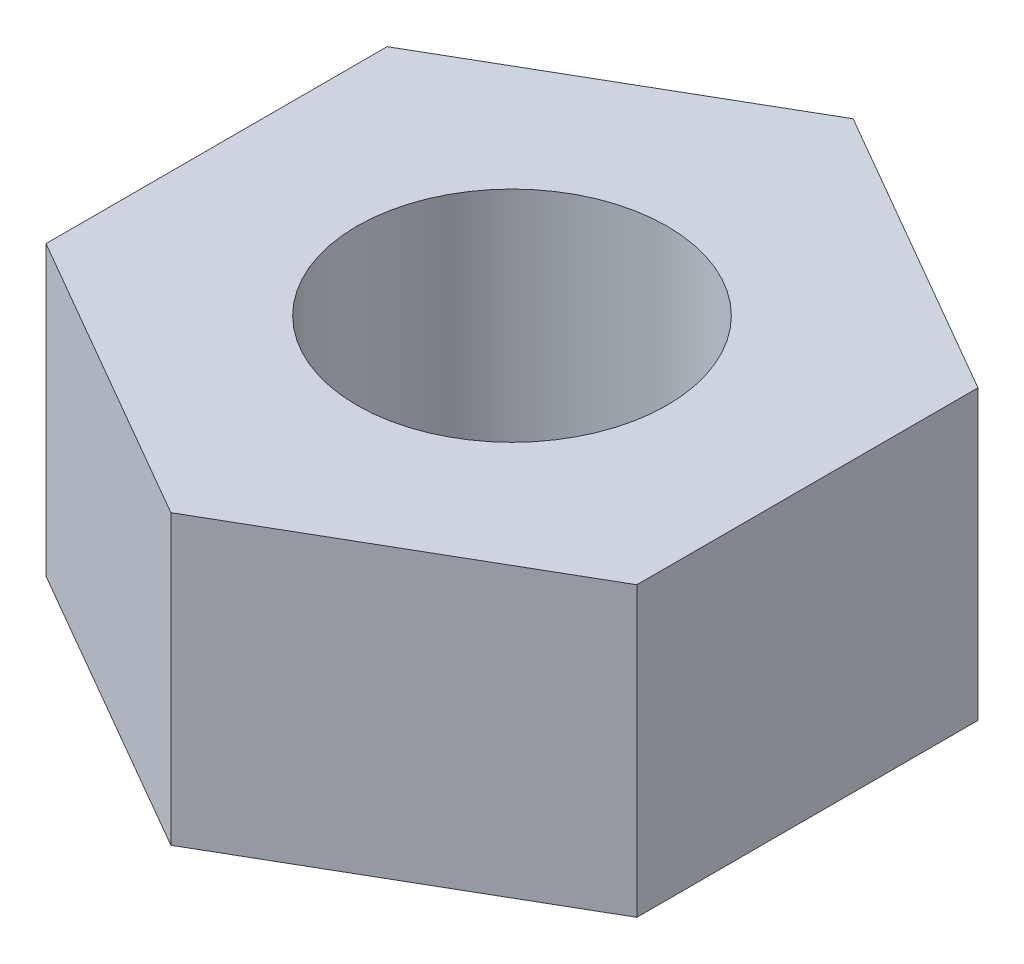
ISO-10303-21;
HEADER;
FILE_DESCRIPTION(('STEP AP214'),'2;1');
FILE_NAME('part.step','',(''),(''),'','','');
FILE_SCHEMA(('AUTOMOTIVE_DESIGN { 1 0 10303 214 1 1 1 1 }'));
ENDSEC;
DATA;
#1=APPLICATION_CONTEXT('core data for automotive mechanical design processes');
#2=APPLICATION_PROTOCOL_DEFINITION('international standard','automotive_design',2000,#1);
#3=PRODUCT_CONTEXT('',#1,'mechanical');
#4=PRODUCT('Part','Part','',(#3));
#5=PRODUCT_RELATED_PRODUCT_CATEGORY('part','',(#4));
#6=PRODUCT_DEFINITION_FORMATION('','',#4);
#7=PRODUCT_DEFINITION_CONTEXT('part definition',#1,'design');
#8=PRODUCT_DEFINITION('design','',#6,#7);
#9=PRODUCT_DEFINITION_SHAPE('','',#8);
#10=(LENGTH_UNIT() NAMED_UNIT(*) SI_UNIT(.MILLI.,.METRE.));
#11=(NAMED_UNIT(*) PLANE_ANGLE_UNIT() SI_UNIT($,.RADIAN.));
#12=(NAMED_UNIT(*) SI_UNIT($,.STERADIAN.) SOLID_ANGLE_UNIT());
#13=UNCERTAINTY_MEASURE_WITH_UNIT(LENGTH_MEASURE(1.E-05),#10,'distance_accuracy_value','');
#14=(GEOMETRIC_REPRESENTATION_CONTEXT(3) GLOBAL_UNCERTAINTY_ASSIGNED_CONTEXT((#13)) GLOBAL_UNIT_ASSIGNED_CONTEXT((#10,
#11,#12)) REPRESENTATION_CONTEXT('',''));
#15=CARTESIAN_POINT('',(0.,0.,0.));
#16=DIRECTION('',(0.,0.,1.));
#17=DIRECTION('',(1.,0.,0.));
#18=AXIS2_PLACEMENT_3D('',#15,#16,#17);
#19=CARTESIAN_POINT('',(0.,3.9,4.61880215351701));
#20=DIRECTION('',(-0.5,0.,-0.866025403784439));
#21=DIRECTION('',(-0.866025403784439,0.,0.5));
#22=AXIS2_PLACEMENT_3D('',#19,#20,#21);
#23=PLANE('',#22);
#24=DIRECTION('',(0.866025403784439,0.,-0.5));
#25=VECTOR('',#24,1.);
#26=CARTESIAN_POINT('',(0.,0.,4.61880215351701));
#27=LINE('',#26,#25);
#28=CARTESIAN_POINT('',(0.,0.,4.61880215351701));
#29=VERTEX_POINT('',#28);
#30=CARTESIAN_POINT('',(4.,0.,2.3094010767585));
#31=VERTEX_POINT('',#30);
#32=EDGE_CURVE('E121',#29,#31,#27,.T.);
#33=ORIENTED_EDGE('',*,*,#32,.T.);
#34=DIRECTION('',(0.,-1.,0.));
#35=VECTOR('',#34,1.);
#36=CARTESIAN_POINT('',(4.,3.9,2.3094010767585));
#37=LINE('',#36,#35);
#38=CARTESIAN_POINT('',(4.,3.9,2.3094010767585));
#39=VERTEX_POINT('',#38);
#40=EDGE_CURVE('E11',#39,#31,#37,.T.);
#41=ORIENTED_EDGE('',*,*,#40,.F.);
#42=DIRECTION('',(0.866025403784439,0.,-0.5));
#43=VECTOR('',#42,1.);
#44=CARTESIAN_POINT('',(0.,3.9,4.61880215351701));
#45=LINE('',#44,#43);
#46=CARTESIAN_POINT('',(0.,3.9,4.61880215351701));
#47=VERTEX_POINT('',#46);
#48=EDGE_CURVE('E132',#47,#39,#45,.T.);
#49=ORIENTED_EDGE('',*,*,#48,.F.);
#50=DIRECTION('',(0.,-1.,0.));
#51=VECTOR('',#50,1.);
#52=CARTESIAN_POINT('',(0.,3.9,4.61880215351701));
#53=LINE('',#52,#51);
#54=EDGE_CURVE('E117',#47,#29,#53,.T.);
#55=ORIENTED_EDGE('',*,*,#54,.T.);
#56=EDGE_LOOP('',(#33,#41,#49,#55));
#57=FACE_BOUND('',#56,.T.);
#58=ADVANCED_FACE('F37',(#57),#23,.F.);
#59=CARTESIAN_POINT('',(4.,3.9,2.3094010767585));
#60=DIRECTION('',(-1.,0.,0.));
#61=DIRECTION('',(0.,0.,1.));
#62=AXIS2_PLACEMENT_3D('',#59,#60,#61);
#63=PLANE('',#62);
#64=DIRECTION('',(0.,0.,-1.));
#65=VECTOR('',#64,1.);
#66=CARTESIAN_POINT('',(4.,0.,2.3094010767585));
#67=LINE('',#66,#65);
#68=CARTESIAN_POINT('',(4.,0.,-2.3094010767585));
#69=VERTEX_POINT('',#68);
#70=EDGE_CURVE('E124',#31,#69,#67,.T.);
#71=ORIENTED_EDGE('',*,*,#70,.T.);
#72=DIRECTION('',(0.,-1.,0.));
#73=VECTOR('',#72,1.);
#74=CARTESIAN_POINT('',(4.,3.9,-2.3094010767585));
#75=LINE('',#74,#73);
#76=CARTESIAN_POINT('',(4.,3.9,-2.3094010767585));
#77=VERTEX_POINT('',#76);
#78=EDGE_CURVE('E45',#77,#69,#75,.T.);
#79=ORIENTED_EDGE('',*,*,#78,.F.);
#80=DIRECTION('',(0.,0.,-1.));
#81=VECTOR('',#80,1.);
#82=CARTESIAN_POINT('',(4.,3.9,2.3094010767585));
#83=LINE('',#82,#81);
#84=EDGE_CURVE('E90',#39,#77,#83,.T.);
#85=ORIENTED_EDGE('',*,*,#84,.F.);
#86=ORIENTED_EDGE('',*,*,#40,.T.);
#87=EDGE_LOOP('',(#71,#79,#85,#86));
#88=FACE_BOUND('',#87,.T.);
#89=ADVANCED_FACE('F157',(#88),#63,.F.);
#90=CARTESIAN_POINT('',(4.,3.9,-2.3094010767585));
#91=DIRECTION('',(-0.5,0.,0.866025403784439));
#92=DIRECTION('',(0.866025403784439,0.,0.5));
#93=AXIS2_PLACEMENT_3D('',#90,#91,#92);
#94=PLANE('',#93);
#95=DIRECTION('',(-0.866025403784439,0.,-0.5));
#96=VECTOR('',#95,1.);
#97=CARTESIAN_POINT('',(4.,0.,-2.3094010767585));
#98=LINE('',#97,#96);
#99=CARTESIAN_POINT('',(0.,0.,-4.61880215351701));
#100=VERTEX_POINT('',#99);
#101=EDGE_CURVE('E127',#69,#100,#98,.T.);
#102=ORIENTED_EDGE('',*,*,#101,.T.);
#103=DIRECTION('',(0.,-1.,0.));
#104=VECTOR('',#103,1.);
#105=CARTESIAN_POINT('',(0.,3.9,-4.61880215351701));
#106=LINE('',#105,#104);
#107=CARTESIAN_POINT('',(0.,3.9,-4.61880215351701));
#108=VERTEX_POINT('',#107);
#109=EDGE_CURVE('E112',#108,#100,#106,.T.);
#110=ORIENTED_EDGE('',*,*,#109,.F.);
#111=DIRECTION('',(-0.866025403784439,0.,-0.5));
#112=VECTOR('',#111,1.);
#113=CARTESIAN_POINT('',(4.,3.9,-2.3094010767585));
#114=LINE('',#113,#112);
#115=EDGE_CURVE('E103',#77,#108,#114,.T.);
#116=ORIENTED_EDGE('',*,*,#115,.F.);
#117=ORIENTED_EDGE('',*,*,#78,.T.);
#118=EDGE_LOOP('',(#102,#110,#116,#117));
#119=FACE_BOUND('',#118,.T.);
#120=ADVANCED_FACE('F138',(#119),#94,.F.);
#121=CARTESIAN_POINT('',(0.,3.9,-4.61880215351701));
#122=DIRECTION('',(0.5,0.,0.866025403784439));
#123=DIRECTION('',(0.866025403784439,0.,-0.5));
#124=AXIS2_PLACEMENT_3D('',#121,#122,#123);
#125=PLANE('',#124);
#126=DIRECTION('',(-0.866025403784439,0.,0.5));
#127=VECTOR('',#126,1.);
#128=CARTESIAN_POINT('',(0.,0.,-4.61880215351701));
#129=LINE('',#128,#127);
#130=CARTESIAN_POINT('',(-4.,0.,-2.3094010767585));
#131=VERTEX_POINT('',#130);
#132=EDGE_CURVE('E111',#100,#131,#129,.T.);
#133=ORIENTED_EDGE('',*,*,#132,.T.);
#134=DIRECTION('',(0.,-1.,0.));
#135=VECTOR('',#134,1.);
#136=CARTESIAN_POINT('',(-4.,3.9,-2.3094010767585));
#137=LINE('',#136,#135);
#138=CARTESIAN_POINT('',(-4.,3.9,-2.3094010767585));
#139=VERTEX_POINT('',#138);
#140=EDGE_CURVE('E108',#139,#131,#137,.T.);
#141=ORIENTED_EDGE('',*,*,#140,.F.);
#142=DIRECTION('',(-0.866025403784439,0.,0.5));
#143=VECTOR('',#142,1.);
#144=CARTESIAN_POINT('',(0.,3.9,-4.61880215351701));
#145=LINE('',#144,#143);
#146=EDGE_CURVE('E97',#108,#139,#145,.T.);
#147=ORIENTED_EDGE('',*,*,#146,.F.);
#148=ORIENTED_EDGE('',*,*,#109,.T.);
#149=EDGE_LOOP('',(#133,#141,#147,#148));
#150=FACE_BOUND('',#149,.T.);
#151=ADVANCED_FACE('F109',(#150),#125,.F.);
#152=CARTESIAN_POINT('',(-4.,3.9,-2.3094010767585));
#153=DIRECTION('',(1.,0.,0.));
#154=DIRECTION('',(0.,0.,-1.));
#155=AXIS2_PLACEMENT_3D('',#152,#153,#154);
#156=PLANE('',#155);
#157=DIRECTION('',(0.,0.,1.));
#158=VECTOR('',#157,1.);
#159=CARTESIAN_POINT('',(-4.,0.,-2.3094010767585));
#160=LINE('',#159,#158);
#161=CARTESIAN_POINT('',(-4.,0.,2.3094010767585));
#162=VERTEX_POINT('',#161);
#163=EDGE_CURVE('E76',#131,#162,#160,.T.);
#164=ORIENTED_EDGE('',*,*,#163,.T.);
#165=DIRECTION('',(0.,-1.,0.));
#166=VECTOR('',#165,1.);
#167=CARTESIAN_POINT('',(-4.,3.9,2.3094010767585));
#168=LINE('',#167,#166);
#169=CARTESIAN_POINT('',(-4.,3.9,2.3094010767585));
#170=VERTEX_POINT('',#169);
#171=EDGE_CURVE('E113',#170,#162,#168,.T.);
#172=ORIENTED_EDGE('',*,*,#171,.F.);
#173=DIRECTION('',(0.,0.,1.));
#174=VECTOR('',#173,1.);
#175=CARTESIAN_POINT('',(-4.,3.9,-2.3094010767585));
#176=LINE('',#175,#174);
#177=EDGE_CURVE('E101',#139,#170,#176,.T.);
#178=ORIENTED_EDGE('',*,*,#177,.F.);
#179=ORIENTED_EDGE('',*,*,#140,.T.);
#180=EDGE_LOOP('',(#164,#172,#178,#179));
#181=FACE_BOUND('',#180,.T.);
#182=ADVANCED_FACE('F115',(#181),#156,.F.);
#183=CARTESIAN_POINT('',(-4.,3.9,2.3094010767585));
#184=DIRECTION('',(0.5,0.,-0.866025403784439));
#185=DIRECTION('',(-0.866025403784439,0.,-0.5));
#186=AXIS2_PLACEMENT_3D('',#183,#184,#185);
#187=PLANE('',#186);
#188=DIRECTION('',(0.866025403784439,0.,0.5));
#189=VECTOR('',#188,1.);
#190=CARTESIAN_POINT('',(-4.,0.,2.3094010767585));
#191=LINE('',#190,#189);
#192=EDGE_CURVE('E82',#162,#29,#191,.T.);
#193=ORIENTED_EDGE('',*,*,#192,.T.);
#194=ORIENTED_EDGE('',*,*,#54,.F.);
#195=DIRECTION('',(0.866025403784439,0.,0.5));
#196=VECTOR('',#195,1.);
#197=CARTESIAN_POINT('',(-4.,3.9,2.3094010767585));
#198=LINE('',#197,#196);
#199=EDGE_CURVE('E53',#170,#47,#198,.T.);
#200=ORIENTED_EDGE('',*,*,#199,.F.);
#201=ORIENTED_EDGE('',*,*,#171,.T.);
#202=EDGE_LOOP('',(#193,#194,#200,#201));
#203=FACE_BOUND('',#202,.T.);
#204=ADVANCED_FACE('F145',(#203),#187,.F.);
#205=CARTESIAN_POINT('',(0.,3.9,0.));
#206=DIRECTION('',(0.,1.,0.));
#207=DIRECTION('',(0.,0.,1.));
#208=AXIS2_PLACEMENT_3D('',#205,#206,#207);
#209=PLANE('',#208);
#210=CARTESIAN_POINT('',(0.,3.9,0.));
#211=DIRECTION('',(0.,-1.,0.));
#212=DIRECTION('',(0.,0.,-1.));
#213=AXIS2_PLACEMENT_3D('',#210,#211,#212);
#214=CIRCLE('',#213,2.1);
#215=CARTESIAN_POINT('',(0.,3.9,-2.1));
#216=VERTEX_POINT('',#215);
#217=EDGE_CURVE('E125',#216,#216,#214,.T.);
#218=ORIENTED_EDGE('',*,*,#217,.T.);
#219=EDGE_LOOP('',(#218));
#220=FACE_BOUND('',#219,.T.);
#221=ORIENTED_EDGE('',*,*,#48,.T.);
#222=ORIENTED_EDGE('',*,*,#84,.T.);
#223=ORIENTED_EDGE('',*,*,#115,.T.);
#224=ORIENTED_EDGE('',*,*,#146,.T.);
#225=ORIENTED_EDGE('',*,*,#177,.T.);
#226=ORIENTED_EDGE('',*,*,#199,.T.);
#227=EDGE_LOOP('',(#221,#222,#223,#224,#225,#226));
#228=FACE_BOUND('',#227,.T.);
#229=ADVANCED_FACE('F99',(#220,#228),#209,.T.);
#230=CARTESIAN_POINT('',(0.,0.,0.));
#231=DIRECTION('',(0.,1.,0.));
#232=DIRECTION('',(0.,0.,1.));
#233=AXIS2_PLACEMENT_3D('',#230,#231,#232);
#234=PLANE('',#233);
#235=CARTESIAN_POINT('',(0.,0.,0.));
#236=DIRECTION('',(0.,-1.,0.));
#237=DIRECTION('',(0.,0.,-1.));
#238=AXIS2_PLACEMENT_3D('',#235,#236,#237);
#239=CIRCLE('',#238,2.1);
#240=CARTESIAN_POINT('',(0.,0.,-2.1));
#241=VERTEX_POINT('',#240);
#242=EDGE_CURVE('E214',#241,#241,#239,.T.);
#243=ORIENTED_EDGE('',*,*,#242,.F.);
#244=EDGE_LOOP('',(#243));
#245=FACE_BOUND('',#244,.T.);
#246=ORIENTED_EDGE('',*,*,#32,.F.);
#247=ORIENTED_EDGE('',*,*,#192,.F.);
#248=ORIENTED_EDGE('',*,*,#163,.F.);
#249=ORIENTED_EDGE('',*,*,#132,.F.);
#250=ORIENTED_EDGE('',*,*,#101,.F.);
#251=ORIENTED_EDGE('',*,*,#70,.F.);
#252=EDGE_LOOP('',(#246,#247,#248,#249,#250,#251));
#253=FACE_BOUND('',#252,.T.);
#254=ADVANCED_FACE('F141',(#245,#253),#234,.F.);
#255=CARTESIAN_POINT('',(0.,0.,0.));
#256=DIRECTION('',(0.,-1.,0.));
#257=DIRECTION('',(0.,0.,-1.));
#258=AXIS2_PLACEMENT_3D('',#255,#256,#257);
#259=CYLINDRICAL_SURFACE('',#258,2.1);
#260=ORIENTED_EDGE('',*,*,#217,.F.);
#261=EDGE_LOOP('',(#260));
#262=FACE_BOUND('',#261,.T.);
#263=ORIENTED_EDGE('',*,*,#242,.T.);
#264=EDGE_LOOP('',(#263));
#265=FACE_BOUND('',#264,.T.);
#266=ADVANCED_FACE('F194',(#262,#265),#259,.F.);
#267=CLOSED_SHELL('',(#58,#89,#120,#151,#182,#204,#229,#254,#266));
#268=MANIFOLD_SOLID_BREP('B2',#267);
#269=ADVANCED_BREP_SHAPE_REPRESENTATION('',(#18,#268),#14);
#270=SHAPE_DEFINITION_REPRESENTATION(#9,#269);
ENDSEC;
END-ISO-10303-21;
